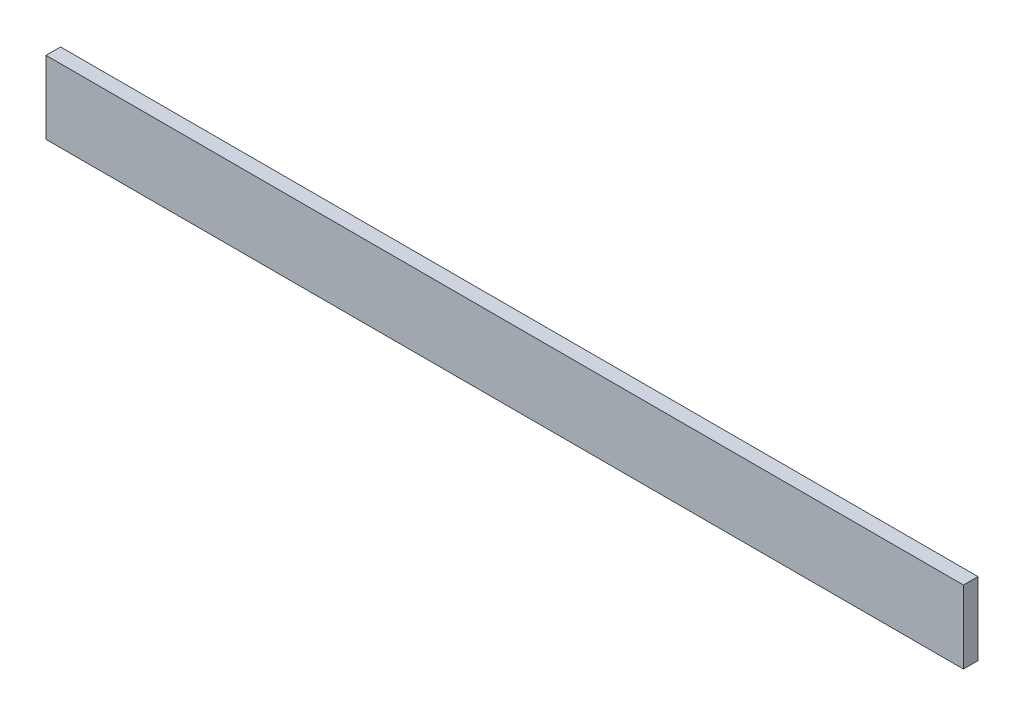
ISO-10303-21;
HEADER;
FILE_DESCRIPTION(('STEP AP214'),'2;1');
FILE_NAME('part.step','',(''),(''),'','','');
FILE_SCHEMA(('AUTOMOTIVE_DESIGN { 1 0 10303 214 1 1 1 1 }'));
ENDSEC;
DATA;
#1=APPLICATION_CONTEXT('core data for automotive mechanical design processes');
#2=APPLICATION_PROTOCOL_DEFINITION('international standard','automotive_design',2000,#1);
#3=PRODUCT_CONTEXT('',#1,'mechanical');
#4=PRODUCT('Part','Part','',(#3));
#5=PRODUCT_RELATED_PRODUCT_CATEGORY('part','',(#4));
#6=PRODUCT_DEFINITION_FORMATION('','',#4);
#7=PRODUCT_DEFINITION_CONTEXT('part definition',#1,'design');
#8=PRODUCT_DEFINITION('design','',#6,#7);
#9=PRODUCT_DEFINITION_SHAPE('','',#8);
#10=(LENGTH_UNIT() NAMED_UNIT(*) SI_UNIT(.MILLI.,.METRE.));
#11=(NAMED_UNIT(*) PLANE_ANGLE_UNIT() SI_UNIT($,.RADIAN.));
#12=(NAMED_UNIT(*) SI_UNIT($,.STERADIAN.) SOLID_ANGLE_UNIT());
#13=UNCERTAINTY_MEASURE_WITH_UNIT(LENGTH_MEASURE(1.E-05),#10,'distance_accuracy_value','');
#14=(GEOMETRIC_REPRESENTATION_CONTEXT(3) GLOBAL_UNCERTAINTY_ASSIGNED_CONTEXT((#13)) GLOBAL_UNIT_ASSIGNED_CONTEXT((#10,
#11,#12)) REPRESENTATION_CONTEXT('',''));
#15=CARTESIAN_POINT('',(0.,0.,0.));
#16=DIRECTION('',(0.,0.,1.));
#17=DIRECTION('',(1.,0.,0.));
#18=AXIS2_PLACEMENT_3D('',#15,#16,#17);
#19=CARTESIAN_POINT('',(-315.,-25.0000000000001,10.));
#20=DIRECTION('',(1.,0.,0.));
#21=DIRECTION('',(0.,0.,-1.));
#22=AXIS2_PLACEMENT_3D('',#19,#20,#21);
#23=PLANE('',#22);
#24=DIRECTION('',(0.,-1.,0.));
#25=VECTOR('',#24,1.);
#26=CARTESIAN_POINT('',(-315.,-25.0000000000001,0.));
#27=LINE('',#26,#25);
#28=CARTESIAN_POINT('',(-315.,24.9999999999999,0.));
#29=VERTEX_POINT('',#28);
#30=CARTESIAN_POINT('',(-315.,-25.0000000000001,0.));
#31=VERTEX_POINT('',#30);
#32=EDGE_CURVE('E107',#29,#31,#27,.T.);
#33=ORIENTED_EDGE('',*,*,#32,.T.);
#34=DIRECTION('',(0.,0.,-1.));
#35=VECTOR('',#34,1.);
#36=CARTESIAN_POINT('',(-315.,-25.0000000000001,10.));
#37=LINE('',#36,#35);
#38=CARTESIAN_POINT('',(-315.,-25.0000000000001,10.));
#39=VERTEX_POINT('',#38);
#40=EDGE_CURVE('E11',#39,#31,#37,.T.);
#41=ORIENTED_EDGE('',*,*,#40,.F.);
#42=DIRECTION('',(0.,-1.,0.));
#43=VECTOR('',#42,1.);
#44=CARTESIAN_POINT('',(-315.,-25.0000000000001,10.));
#45=LINE('',#44,#43);
#46=CARTESIAN_POINT('',(-315.,24.9999999999999,10.));
#47=VERTEX_POINT('',#46);
#48=EDGE_CURVE('E91',#47,#39,#45,.T.);
#49=ORIENTED_EDGE('',*,*,#48,.F.);
#50=DIRECTION('',(0.,0.,-1.));
#51=VECTOR('',#50,1.);
#52=CARTESIAN_POINT('',(-315.,24.9999999999999,10.));
#53=LINE('',#52,#51);
#54=EDGE_CURVE('E103',#47,#29,#53,.T.);
#55=ORIENTED_EDGE('',*,*,#54,.T.);
#56=EDGE_LOOP('',(#33,#41,#49,#55));
#57=FACE_BOUND('',#56,.T.);
#58=ADVANCED_FACE('F39',(#57),#23,.F.);
#59=CARTESIAN_POINT('',(315.,-25.,10.));
#60=DIRECTION('',(0.,1.,0.));
#61=DIRECTION('',(-1.,0.,0.));
#62=AXIS2_PLACEMENT_3D('',#59,#60,#61);
#63=PLANE('',#62);
#64=DIRECTION('',(1.,0.,0.));
#65=VECTOR('',#64,1.);
#66=CARTESIAN_POINT('',(315.,-25.,0.));
#67=LINE('',#66,#65);
#68=CARTESIAN_POINT('',(315.,-25.,0.));
#69=VERTEX_POINT('',#68);
#70=EDGE_CURVE('E96',#31,#69,#67,.T.);
#71=ORIENTED_EDGE('',*,*,#70,.T.);
#72=DIRECTION('',(0.,0.,-1.));
#73=VECTOR('',#72,1.);
#74=CARTESIAN_POINT('',(315.,-25.,10.));
#75=LINE('',#74,#73);
#76=CARTESIAN_POINT('',(315.,-25.,10.));
#77=VERTEX_POINT('',#76);
#78=EDGE_CURVE('E48',#77,#69,#75,.T.);
#79=ORIENTED_EDGE('',*,*,#78,.F.);
#80=DIRECTION('',(1.,0.,0.));
#81=VECTOR('',#80,1.);
#82=CARTESIAN_POINT('',(315.,-25.,10.));
#83=LINE('',#82,#81);
#84=EDGE_CURVE('E86',#39,#77,#83,.T.);
#85=ORIENTED_EDGE('',*,*,#84,.F.);
#86=ORIENTED_EDGE('',*,*,#40,.T.);
#87=EDGE_LOOP('',(#71,#79,#85,#86));
#88=FACE_BOUND('',#87,.T.);
#89=ADVANCED_FACE('F95',(#88),#63,.F.);
#90=CARTESIAN_POINT('',(315.,-25.,10.));
#91=DIRECTION('',(-1.,0.,0.));
#92=DIRECTION('',(0.,0.,1.));
#93=AXIS2_PLACEMENT_3D('',#90,#91,#92);
#94=PLANE('',#93);
#95=DIRECTION('',(0.,1.,0.));
#96=VECTOR('',#95,1.);
#97=CARTESIAN_POINT('',(315.,-25.,0.));
#98=LINE('',#97,#96);
#99=CARTESIAN_POINT('',(315.,25.,0.));
#100=VERTEX_POINT('',#99);
#101=EDGE_CURVE('E73',#69,#100,#98,.T.);
#102=ORIENTED_EDGE('',*,*,#101,.T.);
#103=DIRECTION('',(0.,0.,-1.));
#104=VECTOR('',#103,1.);
#105=CARTESIAN_POINT('',(315.,25.,10.));
#106=LINE('',#105,#104);
#107=CARTESIAN_POINT('',(315.,25.,10.));
#108=VERTEX_POINT('',#107);
#109=EDGE_CURVE('E98',#108,#100,#106,.T.);
#110=ORIENTED_EDGE('',*,*,#109,.F.);
#111=DIRECTION('',(0.,1.,0.));
#112=VECTOR('',#111,1.);
#113=CARTESIAN_POINT('',(315.,-25.,10.));
#114=LINE('',#113,#112);
#115=EDGE_CURVE('E89',#77,#108,#114,.T.);
#116=ORIENTED_EDGE('',*,*,#115,.F.);
#117=ORIENTED_EDGE('',*,*,#78,.T.);
#118=EDGE_LOOP('',(#102,#110,#116,#117));
#119=FACE_BOUND('',#118,.T.);
#120=ADVANCED_FACE('F99',(#119),#94,.F.);
#121=CARTESIAN_POINT('',(315.,25.,10.));
#122=DIRECTION('',(0.,-1.,0.));
#123=DIRECTION('',(1.,0.,0.));
#124=AXIS2_PLACEMENT_3D('',#121,#122,#123);
#125=PLANE('',#124);
#126=DIRECTION('',(-1.,0.,0.));
#127=VECTOR('',#126,1.);
#128=CARTESIAN_POINT('',(315.,25.,0.));
#129=LINE('',#128,#127);
#130=EDGE_CURVE('E79',#100,#29,#129,.T.);
#131=ORIENTED_EDGE('',*,*,#130,.T.);
#132=ORIENTED_EDGE('',*,*,#54,.F.);
#133=DIRECTION('',(-1.,0.,0.));
#134=VECTOR('',#133,1.);
#135=CARTESIAN_POINT('',(315.,25.,10.));
#136=LINE('',#135,#134);
#137=EDGE_CURVE('E56',#108,#47,#136,.T.);
#138=ORIENTED_EDGE('',*,*,#137,.F.);
#139=ORIENTED_EDGE('',*,*,#109,.T.);
#140=EDGE_LOOP('',(#131,#132,#138,#139));
#141=FACE_BOUND('',#140,.T.);
#142=ADVANCED_FACE('F120',(#141),#125,.F.);
#143=CARTESIAN_POINT('',(0.,0.,10.));
#144=DIRECTION('',(0.,0.,1.));
#145=DIRECTION('',(1.,0.,0.));
#146=AXIS2_PLACEMENT_3D('',#143,#144,#145);
#147=PLANE('',#146);
#148=ORIENTED_EDGE('',*,*,#48,.T.);
#149=ORIENTED_EDGE('',*,*,#84,.T.);
#150=ORIENTED_EDGE('',*,*,#115,.T.);
#151=ORIENTED_EDGE('',*,*,#137,.T.);
#152=EDGE_LOOP('',(#148,#149,#150,#151));
#153=FACE_BOUND('',#152,.T.);
#154=ADVANCED_FACE('F87',(#153),#147,.T.);
#155=CARTESIAN_POINT('',(0.,0.,0.));
#156=DIRECTION('',(0.,0.,1.));
#157=DIRECTION('',(1.,0.,0.));
#158=AXIS2_PLACEMENT_3D('',#155,#156,#157);
#159=PLANE('',#158);
#160=ORIENTED_EDGE('',*,*,#32,.F.);
#161=ORIENTED_EDGE('',*,*,#130,.F.);
#162=ORIENTED_EDGE('',*,*,#101,.F.);
#163=ORIENTED_EDGE('',*,*,#70,.F.);
#164=EDGE_LOOP('',(#160,#161,#162,#163));
#165=FACE_BOUND('',#164,.T.);
#166=ADVANCED_FACE('F123',(#165),#159,.F.);
#167=CLOSED_SHELL('',(#58,#89,#120,#142,#154,#166));
#168=MANIFOLD_SOLID_BREP('B2',#167);
#169=ADVANCED_BREP_SHAPE_REPRESENTATION('',(#18,#168),#14);
#170=SHAPE_DEFINITION_REPRESENTATION(#9,#169);
ENDSEC;
END-ISO-10303-21;
